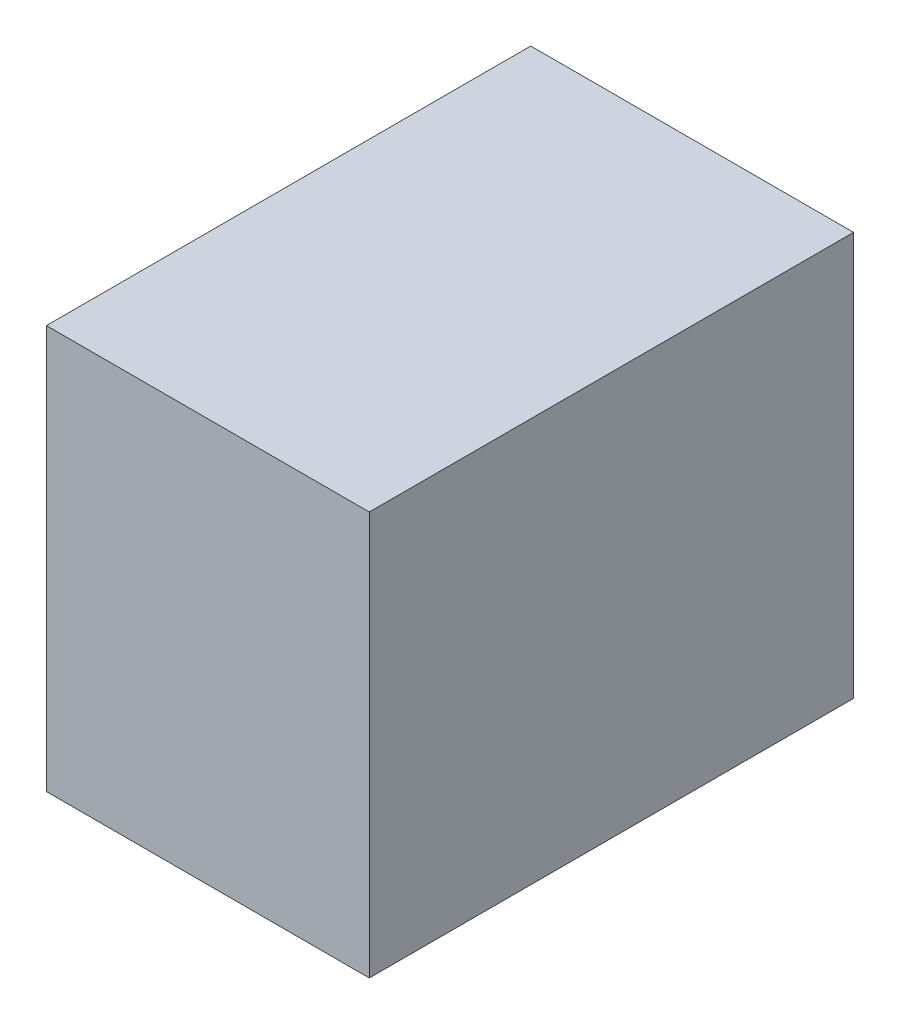
ISO-10303-21;
HEADER;
FILE_DESCRIPTION(('STEP AP214'),'2;1');
FILE_NAME('part.step','',(''),(''),'','','');
FILE_SCHEMA(('AUTOMOTIVE_DESIGN { 1 0 10303 214 1 1 1 1 }'));
ENDSEC;
DATA;
#1=APPLICATION_CONTEXT('core data for automotive mechanical design processes');
#2=APPLICATION_PROTOCOL_DEFINITION('international standard','automotive_design',2000,#1);
#3=PRODUCT_CONTEXT('',#1,'mechanical');
#4=PRODUCT('Part','Part','',(#3));
#5=PRODUCT_RELATED_PRODUCT_CATEGORY('part','',(#4));
#6=PRODUCT_DEFINITION_FORMATION('','',#4);
#7=PRODUCT_DEFINITION_CONTEXT('part definition',#1,'design');
#8=PRODUCT_DEFINITION('design','',#6,#7);
#9=PRODUCT_DEFINITION_SHAPE('','',#8);
#10=(LENGTH_UNIT() NAMED_UNIT(*) SI_UNIT(.MILLI.,.METRE.));
#11=(NAMED_UNIT(*) PLANE_ANGLE_UNIT() SI_UNIT($,.RADIAN.));
#12=(NAMED_UNIT(*) SI_UNIT($,.STERADIAN.) SOLID_ANGLE_UNIT());
#13=UNCERTAINTY_MEASURE_WITH_UNIT(LENGTH_MEASURE(1.E-05),#10,'distance_accuracy_value','');
#14=(GEOMETRIC_REPRESENTATION_CONTEXT(3) GLOBAL_UNCERTAINTY_ASSIGNED_CONTEXT((#13)) GLOBAL_UNIT_ASSIGNED_CONTEXT((#10,
#11,#12)) REPRESENTATION_CONTEXT('',''));
#15=CARTESIAN_POINT('',(0.,0.,0.));
#16=DIRECTION('',(0.,0.,1.));
#17=DIRECTION('',(1.,0.,0.));
#18=AXIS2_PLACEMENT_3D('',#15,#16,#17);
#19=CARTESIAN_POINT('',(270.,320.,-680.));
#20=DIRECTION('',(-1.,0.,0.));
#21=DIRECTION('',(0.,0.,1.));
#22=AXIS2_PLACEMENT_3D('',#19,#20,#21);
#23=PLANE('',#22);
#24=DIRECTION('',(0.,-1.,0.));
#25=VECTOR('',#24,1.);
#26=CARTESIAN_POINT('',(270.,320.,-620.));
#27=LINE('',#26,#25);
#28=CARTESIAN_POINT('',(270.,370.,-620.));
#29=VERTEX_POINT('',#28);
#30=CARTESIAN_POINT('',(270.,320.,-620.));
#31=VERTEX_POINT('',#30);
#32=EDGE_CURVE('E103',#29,#31,#27,.T.);
#33=ORIENTED_EDGE('',*,*,#32,.F.);
#34=DIRECTION('',(0.,0.,1.));
#35=VECTOR('',#34,1.);
#36=CARTESIAN_POINT('',(270.,370.,-680.));
#37=LINE('',#36,#35);
#38=CARTESIAN_POINT('',(270.,370.,-680.));
#39=VERTEX_POINT('',#38);
#40=EDGE_CURVE('E11',#39,#29,#37,.T.);
#41=ORIENTED_EDGE('',*,*,#40,.F.);
#42=DIRECTION('',(0.,-1.,0.));
#43=VECTOR('',#42,1.);
#44=CARTESIAN_POINT('',(270.,320.,-680.));
#45=LINE('',#44,#43);
#46=CARTESIAN_POINT('',(270.,320.,-680.));
#47=VERTEX_POINT('',#46);
#48=EDGE_CURVE('E97',#39,#47,#45,.T.);
#49=ORIENTED_EDGE('',*,*,#48,.T.);
#50=DIRECTION('',(0.,0.,1.));
#51=VECTOR('',#50,1.);
#52=CARTESIAN_POINT('',(270.,320.,-680.));
#53=LINE('',#52,#51);
#54=EDGE_CURVE('E42',#47,#31,#53,.T.);
#55=ORIENTED_EDGE('',*,*,#54,.T.);
#56=EDGE_LOOP('',(#33,#41,#49,#55));
#57=FACE_BOUND('',#56,.T.);
#58=ADVANCED_FACE('F39',(#57),#23,.T.);
#59=CARTESIAN_POINT('',(270.,370.,-680.));
#60=DIRECTION('',(0.,1.,0.));
#61=DIRECTION('',(0.,0.,1.));
#62=AXIS2_PLACEMENT_3D('',#59,#60,#61);
#63=PLANE('',#62);
#64=DIRECTION('',(-1.,0.,0.));
#65=VECTOR('',#64,1.);
#66=CARTESIAN_POINT('',(270.,370.,-620.));
#67=LINE('',#66,#65);
#68=CARTESIAN_POINT('',(310.,370.,-620.));
#69=VERTEX_POINT('',#68);
#70=EDGE_CURVE('E99',#69,#29,#67,.T.);
#71=ORIENTED_EDGE('',*,*,#70,.F.);
#72=DIRECTION('',(0.,0.,1.));
#73=VECTOR('',#72,1.);
#74=CARTESIAN_POINT('',(310.,370.,-680.));
#75=LINE('',#74,#73);
#76=CARTESIAN_POINT('',(310.,370.,-680.));
#77=VERTEX_POINT('',#76);
#78=EDGE_CURVE('E48',#77,#69,#75,.T.);
#79=ORIENTED_EDGE('',*,*,#78,.F.);
#80=DIRECTION('',(-1.,0.,0.));
#81=VECTOR('',#80,1.);
#82=CARTESIAN_POINT('',(270.,370.,-680.));
#83=LINE('',#82,#81);
#84=EDGE_CURVE('E94',#77,#39,#83,.T.);
#85=ORIENTED_EDGE('',*,*,#84,.T.);
#86=ORIENTED_EDGE('',*,*,#40,.T.);
#87=EDGE_LOOP('',(#71,#79,#85,#86));
#88=FACE_BOUND('',#87,.T.);
#89=ADVANCED_FACE('F113',(#88),#63,.T.);
#90=CARTESIAN_POINT('',(310.,320.,-680.));
#91=DIRECTION('',(1.,0.,0.));
#92=DIRECTION('',(0.,0.,-1.));
#93=AXIS2_PLACEMENT_3D('',#90,#91,#92);
#94=PLANE('',#93);
#95=DIRECTION('',(0.,1.,0.));
#96=VECTOR('',#95,1.);
#97=CARTESIAN_POINT('',(310.,320.,-620.));
#98=LINE('',#97,#96);
#99=CARTESIAN_POINT('',(310.,320.,-620.));
#100=VERTEX_POINT('',#99);
#101=EDGE_CURVE('E89',#100,#69,#98,.T.);
#102=ORIENTED_EDGE('',*,*,#101,.F.);
#103=DIRECTION('',(0.,0.,1.));
#104=VECTOR('',#103,1.);
#105=CARTESIAN_POINT('',(310.,320.,-680.));
#106=LINE('',#105,#104);
#107=CARTESIAN_POINT('',(310.,320.,-680.));
#108=VERTEX_POINT('',#107);
#109=EDGE_CURVE('E84',#108,#100,#106,.T.);
#110=ORIENTED_EDGE('',*,*,#109,.F.);
#111=DIRECTION('',(0.,1.,0.));
#112=VECTOR('',#111,1.);
#113=CARTESIAN_POINT('',(310.,320.,-680.));
#114=LINE('',#113,#112);
#115=EDGE_CURVE('E87',#108,#77,#114,.T.);
#116=ORIENTED_EDGE('',*,*,#115,.T.);
#117=ORIENTED_EDGE('',*,*,#78,.T.);
#118=EDGE_LOOP('',(#102,#110,#116,#117));
#119=FACE_BOUND('',#118,.T.);
#120=ADVANCED_FACE('F86',(#119),#94,.T.);
#121=CARTESIAN_POINT('',(270.,320.,-680.));
#122=DIRECTION('',(0.,-1.,0.));
#123=DIRECTION('',(0.,0.,-1.));
#124=AXIS2_PLACEMENT_3D('',#121,#122,#123);
#125=PLANE('',#124);
#126=DIRECTION('',(1.,0.,0.));
#127=VECTOR('',#126,1.);
#128=CARTESIAN_POINT('',(270.,320.,-620.));
#129=LINE('',#128,#127);
#130=EDGE_CURVE('E106',#31,#100,#129,.T.);
#131=ORIENTED_EDGE('',*,*,#130,.F.);
#132=ORIENTED_EDGE('',*,*,#54,.F.);
#133=DIRECTION('',(1.,0.,0.));
#134=VECTOR('',#133,1.);
#135=CARTESIAN_POINT('',(270.,320.,-680.));
#136=LINE('',#135,#134);
#137=EDGE_CURVE('E93',#47,#108,#136,.T.);
#138=ORIENTED_EDGE('',*,*,#137,.T.);
#139=ORIENTED_EDGE('',*,*,#109,.T.);
#140=EDGE_LOOP('',(#131,#132,#138,#139));
#141=FACE_BOUND('',#140,.T.);
#142=ADVANCED_FACE('F96',(#141),#125,.T.);
#143=CARTESIAN_POINT('',(0.,0.,-680.));
#144=DIRECTION('',(0.,0.,-1.));
#145=DIRECTION('',(-1.,0.,0.));
#146=AXIS2_PLACEMENT_3D('',#143,#144,#145);
#147=PLANE('',#146);
#148=ORIENTED_EDGE('',*,*,#48,.F.);
#149=ORIENTED_EDGE('',*,*,#84,.F.);
#150=ORIENTED_EDGE('',*,*,#115,.F.);
#151=ORIENTED_EDGE('',*,*,#137,.F.);
#152=EDGE_LOOP('',(#148,#149,#150,#151));
#153=FACE_BOUND('',#152,.T.);
#154=ADVANCED_FACE('F92',(#153),#147,.T.);
#155=CARTESIAN_POINT('',(0.,0.,-620.));
#156=DIRECTION('',(0.,0.,-1.));
#157=DIRECTION('',(-1.,0.,0.));
#158=AXIS2_PLACEMENT_3D('',#155,#156,#157);
#159=PLANE('',#158);
#160=ORIENTED_EDGE('',*,*,#32,.T.);
#161=ORIENTED_EDGE('',*,*,#130,.T.);
#162=ORIENTED_EDGE('',*,*,#101,.T.);
#163=ORIENTED_EDGE('',*,*,#70,.T.);
#164=EDGE_LOOP('',(#160,#161,#162,#163));
#165=FACE_BOUND('',#164,.T.);
#166=ADVANCED_FACE('F112',(#165),#159,.F.);
#167=CLOSED_SHELL('',(#58,#89,#120,#142,#154,#166));
#168=MANIFOLD_SOLID_BREP('B2',#167);
#169=ADVANCED_BREP_SHAPE_REPRESENTATION('',(#18,#168),#14);
#170=SHAPE_DEFINITION_REPRESENTATION(#9,#169);
ENDSEC;
END-ISO-10303-21;
